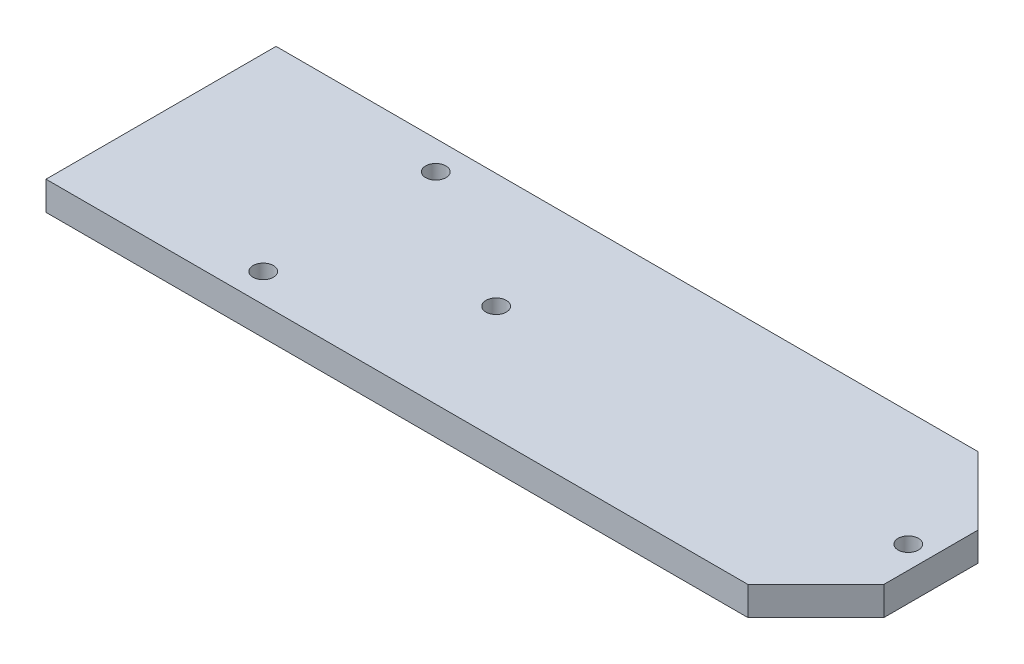
ISO-10303-21;
HEADER;
FILE_DESCRIPTION(('STEP AP214'),'2;1');
FILE_NAME('part.step','',(''),(''),'','','');
FILE_SCHEMA(('AUTOMOTIVE_DESIGN { 1 0 10303 214 1 1 1 1 }'));
ENDSEC;
DATA;
#1=APPLICATION_CONTEXT('core data for automotive mechanical design processes');
#2=APPLICATION_PROTOCOL_DEFINITION('international standard','automotive_design',2000,#1);
#3=PRODUCT_CONTEXT('',#1,'mechanical');
#4=PRODUCT('Part','Part','',(#3));
#5=PRODUCT_RELATED_PRODUCT_CATEGORY('part','',(#4));
#6=PRODUCT_DEFINITION_FORMATION('','',#4);
#7=PRODUCT_DEFINITION_CONTEXT('part definition',#1,'design');
#8=PRODUCT_DEFINITION('design','',#6,#7);
#9=PRODUCT_DEFINITION_SHAPE('','',#8);
#10=(LENGTH_UNIT() NAMED_UNIT(*) SI_UNIT(.MILLI.,.METRE.));
#11=(NAMED_UNIT(*) PLANE_ANGLE_UNIT() SI_UNIT($,.RADIAN.));
#12=(NAMED_UNIT(*) SI_UNIT($,.STERADIAN.) SOLID_ANGLE_UNIT());
#13=UNCERTAINTY_MEASURE_WITH_UNIT(LENGTH_MEASURE(1.E-05),#10,'distance_accuracy_value','');
#14=(GEOMETRIC_REPRESENTATION_CONTEXT(3) GLOBAL_UNCERTAINTY_ASSIGNED_CONTEXT((#13)) GLOBAL_UNIT_ASSIGNED_CONTEXT((#10,
#11,#12)) REPRESENTATION_CONTEXT('',''));
#15=CARTESIAN_POINT('',(0.,0.,0.));
#16=DIRECTION('',(0.,0.,1.));
#17=DIRECTION('',(1.,0.,0.));
#18=AXIS2_PLACEMENT_3D('',#15,#16,#17);
#19=CARTESIAN_POINT('',(0.,6.35,0.));
#20=DIRECTION('',(0.,-1.,0.));
#21=DIRECTION('',(0.,0.,-1.));
#22=AXIS2_PLACEMENT_3D('',#19,#20,#21);
#23=PLANE('',#22);
#24=CARTESIAN_POINT('',(41.619,6.35,-44.45));
#25=DIRECTION('',(0.,1.,0.));
#26=DIRECTION('',(0.,0.,1.));
#27=AXIS2_PLACEMENT_3D('',#24,#25,#26);
#28=CIRCLE('',#27,2.25);
#29=CARTESIAN_POINT('',(41.619,6.35,-42.2));
#30=VERTEX_POINT('',#29);
#31=EDGE_CURVE('E128',#30,#30,#28,.T.);
#32=ORIENTED_EDGE('',*,*,#31,.F.);
#33=EDGE_LOOP('',(#32));
#34=FACE_BOUND('',#33,.T.);
#35=CARTESIAN_POINT('',(165.,6.35,-25.4));
#36=DIRECTION('',(0.,1.,0.));
#37=DIRECTION('',(0.,0.,1.));
#38=AXIS2_PLACEMENT_3D('',#35,#36,#37);
#39=CIRCLE('',#38,2.25000000000001);
#40=CARTESIAN_POINT('',(165.,6.35,-23.15));
#41=VERTEX_POINT('',#40);
#42=EDGE_CURVE('E140',#41,#41,#39,.T.);
#43=ORIENTED_EDGE('',*,*,#42,.F.);
#44=EDGE_LOOP('',(#43));
#45=FACE_BOUND('',#44,.T.);
#46=DIRECTION('',(1.,0.,0.));
#47=VECTOR('',#46,1.);
#48=CARTESIAN_POINT('',(0.,6.35,0.));
#49=LINE('',#48,#47);
#50=CARTESIAN_POINT('',(0.,6.35,0.));
#51=VERTEX_POINT('',#50);
#52=CARTESIAN_POINT('',(155.,6.35,0.));
#53=VERTEX_POINT('',#52);
#54=EDGE_CURVE('E149',#51,#53,#49,.T.);
#55=ORIENTED_EDGE('',*,*,#54,.T.);
#56=DIRECTION('',(-0.707106781186548,0.,0.707106781186547));
#57=VECTOR('',#56,1.);
#58=CARTESIAN_POINT('',(170.,6.35,-15.));
#59=LINE('',#58,#57);
#60=CARTESIAN_POINT('',(170.,6.35,-15.));
#61=VERTEX_POINT('',#60);
#62=EDGE_CURVE('E49',#53,#61,#59,.F.);
#63=ORIENTED_EDGE('',*,*,#62,.T.);
#64=DIRECTION('',(0.,0.,-1.));
#65=VECTOR('',#64,1.);
#66=CARTESIAN_POINT('',(170.,6.35,0.));
#67=LINE('',#66,#65);
#68=CARTESIAN_POINT('',(170.,6.35,-35.8));
#69=VERTEX_POINT('',#68);
#70=EDGE_CURVE('E152',#61,#69,#67,.T.);
#71=ORIENTED_EDGE('',*,*,#70,.T.);
#72=DIRECTION('',(0.707106781186546,0.,0.707106781186549));
#73=VECTOR('',#72,1.);
#74=CARTESIAN_POINT('',(155.,6.35,-50.8));
#75=LINE('',#74,#73);
#76=CARTESIAN_POINT('',(155.,6.35,-50.8));
#77=VERTEX_POINT('',#76);
#78=EDGE_CURVE('E56',#69,#77,#75,.F.);
#79=ORIENTED_EDGE('',*,*,#78,.T.);
#80=DIRECTION('',(-1.,0.,0.));
#81=VECTOR('',#80,1.);
#82=CARTESIAN_POINT('',(0.,6.35,-50.8));
#83=LINE('',#82,#81);
#84=CARTESIAN_POINT('',(0.,6.35,-50.8));
#85=VERTEX_POINT('',#84);
#86=EDGE_CURVE('E154',#77,#85,#83,.T.);
#87=ORIENTED_EDGE('',*,*,#86,.T.);
#88=DIRECTION('',(0.,0.,1.));
#89=VECTOR('',#88,1.);
#90=CARTESIAN_POINT('',(0.,6.35,0.));
#91=LINE('',#90,#89);
#92=EDGE_CURVE('E146',#85,#51,#91,.T.);
#93=ORIENTED_EDGE('',*,*,#92,.T.);
#94=EDGE_LOOP('',(#55,#63,#71,#79,#87,#93));
#95=FACE_BOUND('',#94,.T.);
#96=CARTESIAN_POINT('',(73.999999882,6.35,-25.4));
#97=DIRECTION('',(0.,1.,0.));
#98=DIRECTION('',(0.,0.,1.));
#99=AXIS2_PLACEMENT_3D('',#96,#97,#98);
#100=CIRCLE('',#99,2.25000000000011);
#101=CARTESIAN_POINT('',(73.999999882,6.35,-23.1499999999999));
#102=VERTEX_POINT('',#101);
#103=EDGE_CURVE('E134',#102,#102,#100,.T.);
#104=ORIENTED_EDGE('',*,*,#103,.F.);
#105=EDGE_LOOP('',(#104));
#106=FACE_BOUND('',#105,.T.);
#107=CARTESIAN_POINT('',(41.619,6.35,-6.35));
#108=DIRECTION('',(0.,1.,0.));
#109=DIRECTION('',(0.,0.,1.));
#110=AXIS2_PLACEMENT_3D('',#107,#108,#109);
#111=CIRCLE('',#110,2.25);
#112=CARTESIAN_POINT('',(41.619,6.35,-4.1));
#113=VERTEX_POINT('',#112);
#114=EDGE_CURVE('E122',#113,#113,#111,.T.);
#115=ORIENTED_EDGE('',*,*,#114,.F.);
#116=EDGE_LOOP('',(#115));
#117=FACE_BOUND('',#116,.T.);
#118=ADVANCED_FACE('F41',(#34,#45,#95,#106,#117),#23,.F.);
#119=CARTESIAN_POINT('',(0.,0.,0.));
#120=DIRECTION('',(0.,-1.,0.));
#121=DIRECTION('',(0.,0.,-1.));
#122=AXIS2_PLACEMENT_3D('',#119,#120,#121);
#123=PLANE('',#122);
#124=CARTESIAN_POINT('',(41.619,0.,-44.45));
#125=DIRECTION('',(0.,1.,0.));
#126=DIRECTION('',(0.,0.,1.));
#127=AXIS2_PLACEMENT_3D('',#124,#125,#126);
#128=CIRCLE('',#127,2.25);
#129=CARTESIAN_POINT('',(41.619,0.,-42.2));
#130=VERTEX_POINT('',#129);
#131=EDGE_CURVE('E125',#130,#130,#128,.T.);
#132=ORIENTED_EDGE('',*,*,#131,.T.);
#133=EDGE_LOOP('',(#132));
#134=FACE_BOUND('',#133,.T.);
#135=CARTESIAN_POINT('',(165.,0.,-25.4));
#136=DIRECTION('',(0.,1.,0.));
#137=DIRECTION('',(0.,0.,1.));
#138=AXIS2_PLACEMENT_3D('',#135,#136,#137);
#139=CIRCLE('',#138,2.25000000000001);
#140=CARTESIAN_POINT('',(165.,0.,-23.15));
#141=VERTEX_POINT('',#140);
#142=EDGE_CURVE('E137',#141,#141,#139,.T.);
#143=ORIENTED_EDGE('',*,*,#142,.T.);
#144=EDGE_LOOP('',(#143));
#145=FACE_BOUND('',#144,.T.);
#146=DIRECTION('',(0.,0.,-1.));
#147=VECTOR('',#146,1.);
#148=CARTESIAN_POINT('',(170.,0.,0.));
#149=LINE('',#148,#147);
#150=CARTESIAN_POINT('',(170.,0.,-15.0000000000001));
#151=VERTEX_POINT('',#150);
#152=CARTESIAN_POINT('',(170.,0.,-35.8));
#153=VERTEX_POINT('',#152);
#154=EDGE_CURVE('E161',#151,#153,#149,.T.);
#155=ORIENTED_EDGE('',*,*,#154,.F.);
#156=DIRECTION('',(0.707106781186548,0.,-0.707106781186547));
#157=VECTOR('',#156,1.);
#158=CARTESIAN_POINT('',(77.4999999999998,0.,77.5));
#159=LINE('',#158,#157);
#160=CARTESIAN_POINT('',(155.,0.,0.));
#161=VERTEX_POINT('',#160);
#162=EDGE_CURVE('E177',#151,#161,#159,.F.);
#163=ORIENTED_EDGE('',*,*,#162,.T.);
#164=DIRECTION('',(1.,0.,0.));
#165=VECTOR('',#164,1.);
#166=CARTESIAN_POINT('',(0.,0.,0.));
#167=LINE('',#166,#165);
#168=CARTESIAN_POINT('',(0.,0.,0.));
#169=VERTEX_POINT('',#168);
#170=EDGE_CURVE('E159',#169,#161,#167,.T.);
#171=ORIENTED_EDGE('',*,*,#170,.F.);
#172=DIRECTION('',(0.,0.,1.));
#173=VECTOR('',#172,1.);
#174=CARTESIAN_POINT('',(0.,0.,0.));
#175=LINE('',#174,#173);
#176=CARTESIAN_POINT('',(0.,0.,-50.8));
#177=VERTEX_POINT('',#176);
#178=EDGE_CURVE('E143',#177,#169,#175,.T.);
#179=ORIENTED_EDGE('',*,*,#178,.F.);
#180=DIRECTION('',(-1.,0.,0.));
#181=VECTOR('',#180,1.);
#182=CARTESIAN_POINT('',(0.,0.,-50.8));
#183=LINE('',#182,#181);
#184=CARTESIAN_POINT('',(155.,0.,-50.8));
#185=VERTEX_POINT('',#184);
#186=EDGE_CURVE('E150',#185,#177,#183,.T.);
#187=ORIENTED_EDGE('',*,*,#186,.F.);
#188=DIRECTION('',(-0.707106781186546,0.,-0.707106781186549));
#189=VECTOR('',#188,1.);
#190=CARTESIAN_POINT('',(102.9,0.,-102.9));
#191=LINE('',#190,#189);
#192=EDGE_CURVE('E175',#185,#153,#191,.F.);
#193=ORIENTED_EDGE('',*,*,#192,.T.);
#194=EDGE_LOOP('',(#155,#163,#171,#179,#187,#193));
#195=FACE_BOUND('',#194,.T.);
#196=CARTESIAN_POINT('',(73.999999882,0.,-25.4));
#197=DIRECTION('',(0.,1.,0.));
#198=DIRECTION('',(0.,0.,1.));
#199=AXIS2_PLACEMENT_3D('',#196,#197,#198);
#200=CIRCLE('',#199,2.25000000000011);
#201=CARTESIAN_POINT('',(73.999999882,0.,-23.1499999999999));
#202=VERTEX_POINT('',#201);
#203=EDGE_CURVE('E131',#202,#202,#200,.T.);
#204=ORIENTED_EDGE('',*,*,#203,.T.);
#205=EDGE_LOOP('',(#204));
#206=FACE_BOUND('',#205,.T.);
#207=CARTESIAN_POINT('',(41.619,0.,-6.35));
#208=DIRECTION('',(0.,1.,0.));
#209=DIRECTION('',(0.,0.,1.));
#210=AXIS2_PLACEMENT_3D('',#207,#208,#209);
#211=CIRCLE('',#210,2.25);
#212=CARTESIAN_POINT('',(41.619,0.,-4.1));
#213=VERTEX_POINT('',#212);
#214=EDGE_CURVE('E121',#213,#213,#211,.T.);
#215=ORIENTED_EDGE('',*,*,#214,.T.);
#216=EDGE_LOOP('',(#215));
#217=FACE_BOUND('',#216,.T.);
#218=ADVANCED_FACE('F191',(#134,#145,#195,#206,#217),#123,.T.);
#219=CARTESIAN_POINT('',(0.,6.35,0.));
#220=DIRECTION('',(1.,0.,0.));
#221=DIRECTION('',(0.,0.,-1.));
#222=AXIS2_PLACEMENT_3D('',#219,#220,#221);
#223=PLANE('',#222);
#224=CARTESIAN_POINT('',(0.,3.175,-42.9));
#225=DIRECTION('',(-1.,0.,0.));
#226=DIRECTION('',(0.,0.,1.));
#227=AXIS2_PLACEMENT_3D('',#224,#225,#226);
#228=CIRCLE('',#227,1.64999999999999);
#229=CARTESIAN_POINT('',(0.,3.175,-41.25));
#230=VERTEX_POINT('',#229);
#231=EDGE_CURVE('E111',#230,#230,#228,.T.);
#232=ORIENTED_EDGE('',*,*,#231,.F.);
#233=EDGE_LOOP('',(#232));
#234=FACE_BOUND('',#233,.T.);
#235=CARTESIAN_POINT('',(0.,3.175,-7.89999999999999));
#236=DIRECTION('',(-1.,0.,0.));
#237=DIRECTION('',(0.,0.,1.));
#238=AXIS2_PLACEMENT_3D('',#235,#236,#237);
#239=CIRCLE('',#238,1.64999999999999);
#240=CARTESIAN_POINT('',(0.,3.175,-6.25));
#241=VERTEX_POINT('',#240);
#242=EDGE_CURVE('E110',#241,#241,#239,.T.);
#243=ORIENTED_EDGE('',*,*,#242,.F.);
#244=EDGE_LOOP('',(#243));
#245=FACE_BOUND('',#244,.T.);
#246=ORIENTED_EDGE('',*,*,#178,.T.);
#247=DIRECTION('',(0.,-1.,0.));
#248=VECTOR('',#247,1.);
#249=CARTESIAN_POINT('',(0.,6.35,0.));
#250=LINE('',#249,#248);
#251=EDGE_CURVE('E167',#51,#169,#250,.T.);
#252=ORIENTED_EDGE('',*,*,#251,.F.);
#253=ORIENTED_EDGE('',*,*,#92,.F.);
#254=DIRECTION('',(0.,-1.,0.));
#255=VECTOR('',#254,1.);
#256=CARTESIAN_POINT('',(0.,6.35,-50.8));
#257=LINE('',#256,#255);
#258=EDGE_CURVE('E156',#85,#177,#257,.T.);
#259=ORIENTED_EDGE('',*,*,#258,.T.);
#260=EDGE_LOOP('',(#246,#252,#253,#259));
#261=FACE_BOUND('',#260,.T.);
#262=ADVANCED_FACE('F198',(#234,#245,#261),#223,.F.);
#263=CARTESIAN_POINT('',(0.,6.35,0.));
#264=DIRECTION('',(0.,0.,-1.));
#265=DIRECTION('',(-1.,0.,0.));
#266=AXIS2_PLACEMENT_3D('',#263,#264,#265);
#267=PLANE('',#266);
#268=ORIENTED_EDGE('',*,*,#170,.T.);
#269=DIRECTION('',(0.,1.,0.));
#270=VECTOR('',#269,1.);
#271=CARTESIAN_POINT('',(155.,6.35,0.));
#272=LINE('',#271,#270);
#273=EDGE_CURVE('E64',#161,#53,#272,.T.);
#274=ORIENTED_EDGE('',*,*,#273,.T.);
#275=ORIENTED_EDGE('',*,*,#54,.F.);
#276=ORIENTED_EDGE('',*,*,#251,.T.);
#277=EDGE_LOOP('',(#268,#274,#275,#276));
#278=FACE_BOUND('',#277,.T.);
#279=ADVANCED_FACE('F194',(#278),#267,.F.);
#280=CARTESIAN_POINT('',(170.,6.35,0.));
#281=DIRECTION('',(-1.,0.,0.));
#282=DIRECTION('',(0.,0.,1.));
#283=AXIS2_PLACEMENT_3D('',#280,#281,#282);
#284=PLANE('',#283);
#285=ORIENTED_EDGE('',*,*,#70,.F.);
#286=DIRECTION('',(0.,-1.,0.));
#287=VECTOR('',#286,1.);
#288=CARTESIAN_POINT('',(170.,6.35,-15.));
#289=LINE('',#288,#287);
#290=EDGE_CURVE('E172',#61,#151,#289,.T.);
#291=ORIENTED_EDGE('',*,*,#290,.T.);
#292=ORIENTED_EDGE('',*,*,#154,.T.);
#293=DIRECTION('',(0.,1.,0.));
#294=VECTOR('',#293,1.);
#295=CARTESIAN_POINT('',(170.,6.35,-35.8));
#296=LINE('',#295,#294);
#297=EDGE_CURVE('E170',#153,#69,#296,.T.);
#298=ORIENTED_EDGE('',*,*,#297,.T.);
#299=EDGE_LOOP('',(#285,#291,#292,#298));
#300=FACE_BOUND('',#299,.T.);
#301=ADVANCED_FACE('F186',(#300),#284,.F.);
#302=CARTESIAN_POINT('',(0.,6.35,-50.8));
#303=DIRECTION('',(0.,0.,1.));
#304=DIRECTION('',(1.,0.,0.));
#305=AXIS2_PLACEMENT_3D('',#302,#303,#304);
#306=PLANE('',#305);
#307=ORIENTED_EDGE('',*,*,#86,.F.);
#308=DIRECTION('',(0.,-1.,0.));
#309=VECTOR('',#308,1.);
#310=CARTESIAN_POINT('',(155.,6.35,-50.8));
#311=LINE('',#310,#309);
#312=EDGE_CURVE('E11',#77,#185,#311,.T.);
#313=ORIENTED_EDGE('',*,*,#312,.T.);
#314=ORIENTED_EDGE('',*,*,#186,.T.);
#315=ORIENTED_EDGE('',*,*,#258,.F.);
#316=EDGE_LOOP('',(#307,#313,#314,#315));
#317=FACE_BOUND('',#316,.T.);
#318=ADVANCED_FACE('F202',(#317),#306,.F.);
#319=CARTESIAN_POINT('',(165.,6.35,-25.4));
#320=DIRECTION('',(0.,-1.,0.));
#321=DIRECTION('',(0.,0.,-1.));
#322=AXIS2_PLACEMENT_3D('',#319,#320,#321);
#323=CYLINDRICAL_SURFACE('',#322,2.25000000000001);
#324=ORIENTED_EDGE('',*,*,#42,.T.);
#325=EDGE_LOOP('',(#324));
#326=FACE_BOUND('',#325,.T.);
#327=ORIENTED_EDGE('',*,*,#142,.F.);
#328=EDGE_LOOP('',(#327));
#329=FACE_BOUND('',#328,.T.);
#330=ADVANCED_FACE('F225',(#326,#329),#323,.F.);
#331=CARTESIAN_POINT('',(73.999999882,6.35,-25.4));
#332=DIRECTION('',(0.,-1.,0.));
#333=DIRECTION('',(0.,0.,-1.));
#334=AXIS2_PLACEMENT_3D('',#331,#332,#333);
#335=CYLINDRICAL_SURFACE('',#334,2.25000000000011);
#336=ORIENTED_EDGE('',*,*,#103,.T.);
#337=EDGE_LOOP('',(#336));
#338=FACE_BOUND('',#337,.T.);
#339=ORIENTED_EDGE('',*,*,#203,.F.);
#340=EDGE_LOOP('',(#339));
#341=FACE_BOUND('',#340,.T.);
#342=ADVANCED_FACE('F255',(#338,#341),#335,.F.);
#343=CARTESIAN_POINT('',(41.619,6.35,-44.45));
#344=DIRECTION('',(0.,-1.,0.));
#345=DIRECTION('',(0.,0.,-1.));
#346=AXIS2_PLACEMENT_3D('',#343,#344,#345);
#347=CYLINDRICAL_SURFACE('',#346,2.25);
#348=ORIENTED_EDGE('',*,*,#31,.T.);
#349=EDGE_LOOP('',(#348));
#350=FACE_BOUND('',#349,.T.);
#351=ORIENTED_EDGE('',*,*,#131,.F.);
#352=EDGE_LOOP('',(#351));
#353=FACE_BOUND('',#352,.T.);
#354=ADVANCED_FACE('F252',(#350,#353),#347,.F.);
#355=CARTESIAN_POINT('',(41.619,6.35,-6.35));
#356=DIRECTION('',(0.,-1.,0.));
#357=DIRECTION('',(0.,0.,-1.));
#358=AXIS2_PLACEMENT_3D('',#355,#356,#357);
#359=CYLINDRICAL_SURFACE('',#358,2.25);
#360=ORIENTED_EDGE('',*,*,#114,.T.);
#361=EDGE_LOOP('',(#360));
#362=FACE_BOUND('',#361,.T.);
#363=ORIENTED_EDGE('',*,*,#214,.F.);
#364=EDGE_LOOP('',(#363));
#365=FACE_BOUND('',#364,.T.);
#366=ADVANCED_FACE('F213',(#362,#365),#359,.F.);
#367=CARTESIAN_POINT('',(170.,6.35,-15.));
#368=DIRECTION('',(-0.707106781186547,0.,-0.707106781186548));
#369=DIRECTION('',(0.,-1.,0.));
#370=AXIS2_PLACEMENT_3D('',#367,#368,#369);
#371=PLANE('',#370);
#372=ORIENTED_EDGE('',*,*,#62,.F.);
#373=ORIENTED_EDGE('',*,*,#273,.F.);
#374=ORIENTED_EDGE('',*,*,#162,.F.);
#375=ORIENTED_EDGE('',*,*,#290,.F.);
#376=EDGE_LOOP('',(#372,#373,#374,#375));
#377=FACE_BOUND('',#376,.T.);
#378=ADVANCED_FACE('F189',(#377),#371,.F.);
#379=CARTESIAN_POINT('',(155.,6.35,-50.8));
#380=DIRECTION('',(-0.707106781186549,0.,0.707106781186546));
#381=DIRECTION('',(0.,-1.,0.));
#382=AXIS2_PLACEMENT_3D('',#379,#380,#381);
#383=PLANE('',#382);
#384=ORIENTED_EDGE('',*,*,#78,.F.);
#385=ORIENTED_EDGE('',*,*,#297,.F.);
#386=ORIENTED_EDGE('',*,*,#192,.F.);
#387=ORIENTED_EDGE('',*,*,#312,.F.);
#388=EDGE_LOOP('',(#384,#385,#386,#387));
#389=FACE_BOUND('',#388,.T.);
#390=ADVANCED_FACE('F43',(#389),#383,.F.);
#391=CARTESIAN_POINT('',(25.4,3.175,-7.89999999999999));
#392=DIRECTION('',(-1.,0.,0.));
#393=DIRECTION('',(0.,0.,1.));
#394=AXIS2_PLACEMENT_3D('',#391,#392,#393);
#395=CONICAL_SURFACE('',#394,1.64999999999999,1.02974425867665);
#396=CARTESIAN_POINT('',(26.3914200213955,3.17499999999999,-7.89999999999999));
#397=VERTEX_POINT('',#396);
#398=VERTEX_LOOP('',#397);
#399=FACE_BOUND('',#398,.T.);
#400=CARTESIAN_POINT('',(25.4,3.175,-7.89999999999999));
#401=DIRECTION('',(-1.,0.,0.));
#402=DIRECTION('',(0.,0.,1.));
#403=AXIS2_PLACEMENT_3D('',#400,#401,#402);
#404=CIRCLE('',#403,1.64999999999999);
#405=CARTESIAN_POINT('',(25.4,3.175,-6.25));
#406=VERTEX_POINT('',#405);
#407=EDGE_CURVE('E114',#406,#406,#404,.T.);
#408=ORIENTED_EDGE('',*,*,#407,.T.);
#409=EDGE_LOOP('',(#408));
#410=FACE_BOUND('',#409,.T.);
#411=ADVANCED_FACE('F206',(#399,#410),#395,.F.);
#412=CARTESIAN_POINT('',(0.,3.175,-7.89999999999999));
#413=DIRECTION('',(-1.,0.,0.));
#414=DIRECTION('',(0.,0.,1.));
#415=AXIS2_PLACEMENT_3D('',#412,#413,#414);
#416=CYLINDRICAL_SURFACE('',#415,1.64999999999999);
#417=ORIENTED_EDGE('',*,*,#407,.F.);
#418=EDGE_LOOP('',(#417));
#419=FACE_BOUND('',#418,.T.);
#420=ORIENTED_EDGE('',*,*,#242,.T.);
#421=EDGE_LOOP('',(#420));
#422=FACE_BOUND('',#421,.T.);
#423=ADVANCED_FACE('F104',(#419,#422),#416,.F.);
#424=CARTESIAN_POINT('',(25.4,3.175,-42.9));
#425=DIRECTION('',(-1.,0.,0.));
#426=DIRECTION('',(0.,0.,1.));
#427=AXIS2_PLACEMENT_3D('',#424,#425,#426);
#428=CONICAL_SURFACE('',#427,1.64999999999999,1.02974425867665);
#429=CARTESIAN_POINT('',(26.3914200213955,3.17499999999999,-42.9));
#430=VERTEX_POINT('',#429);
#431=VERTEX_LOOP('',#430);
#432=FACE_BOUND('',#431,.T.);
#433=CARTESIAN_POINT('',(25.4,3.175,-42.9));
#434=DIRECTION('',(-1.,0.,0.));
#435=DIRECTION('',(0.,0.,1.));
#436=AXIS2_PLACEMENT_3D('',#433,#434,#435);
#437=CIRCLE('',#436,1.64999999999999);
#438=CARTESIAN_POINT('',(25.4,3.175,-41.25));
#439=VERTEX_POINT('',#438);
#440=EDGE_CURVE('E108',#439,#439,#437,.T.);
#441=ORIENTED_EDGE('',*,*,#440,.T.);
#442=EDGE_LOOP('',(#441));
#443=FACE_BOUND('',#442,.T.);
#444=ADVANCED_FACE('F100',(#432,#443),#428,.F.);
#445=CARTESIAN_POINT('',(0.,3.175,-42.9));
#446=DIRECTION('',(-1.,0.,0.));
#447=DIRECTION('',(0.,0.,1.));
#448=AXIS2_PLACEMENT_3D('',#445,#446,#447);
#449=CYLINDRICAL_SURFACE('',#448,1.64999999999999);
#450=ORIENTED_EDGE('',*,*,#440,.F.);
#451=EDGE_LOOP('',(#450));
#452=FACE_BOUND('',#451,.T.);
#453=ORIENTED_EDGE('',*,*,#231,.T.);
#454=EDGE_LOOP('',(#453));
#455=FACE_BOUND('',#454,.T.);
#456=ADVANCED_FACE('F103',(#452,#455),#449,.F.);
#457=CLOSED_SHELL('',(#118,#218,#262,#279,#301,#318,#330,#342,#354,#366,#378,#390,#411,#423,
#444,#456));
#458=MANIFOLD_SOLID_BREP('B2',#457);
#459=ADVANCED_BREP_SHAPE_REPRESENTATION('',(#18,#458),#14);
#460=SHAPE_DEFINITION_REPRESENTATION(#9,#459);
ENDSEC;
END-ISO-10303-21;
